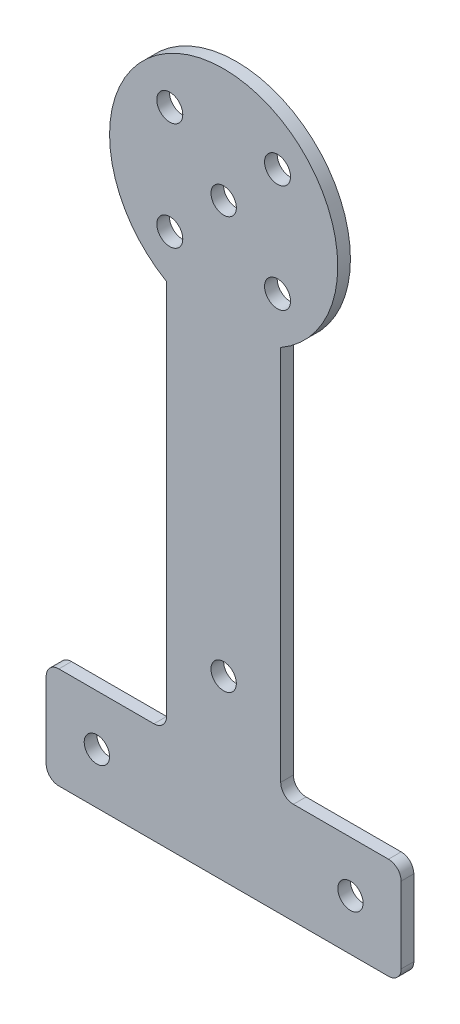
ISO-10303-21;
HEADER;
FILE_DESCRIPTION(('STEP AP214'),'2;1');
FILE_NAME('part.step','',(''),(''),'','','');
FILE_SCHEMA(('AUTOMOTIVE_DESIGN { 1 0 10303 214 1 1 1 1 }'));
ENDSEC;
DATA;
#1=APPLICATION_CONTEXT('core data for automotive mechanical design processes');
#2=APPLICATION_PROTOCOL_DEFINITION('international standard','automotive_design',2000,#1);
#3=PRODUCT_CONTEXT('',#1,'mechanical');
#4=PRODUCT('Part','Part','',(#3));
#5=PRODUCT_RELATED_PRODUCT_CATEGORY('part','',(#4));
#6=PRODUCT_DEFINITION_FORMATION('','',#4);
#7=PRODUCT_DEFINITION_CONTEXT('part definition',#1,'design');
#8=PRODUCT_DEFINITION('design','',#6,#7);
#9=PRODUCT_DEFINITION_SHAPE('','',#8);
#10=(LENGTH_UNIT() NAMED_UNIT(*) SI_UNIT(.MILLI.,.METRE.));
#11=(NAMED_UNIT(*) PLANE_ANGLE_UNIT() SI_UNIT($,.RADIAN.));
#12=(NAMED_UNIT(*) SI_UNIT($,.STERADIAN.) SOLID_ANGLE_UNIT());
#13=UNCERTAINTY_MEASURE_WITH_UNIT(LENGTH_MEASURE(1.E-05),#10,'distance_accuracy_value','');
#14=(GEOMETRIC_REPRESENTATION_CONTEXT(3) GLOBAL_UNCERTAINTY_ASSIGNED_CONTEXT((#13)) GLOBAL_UNIT_ASSIGNED_CONTEXT((#10,
#11,#12)) REPRESENTATION_CONTEXT('',''));
#15=CARTESIAN_POINT('',(0.,0.,0.));
#16=DIRECTION('',(0.,0.,1.));
#17=DIRECTION('',(1.,0.,0.));
#18=AXIS2_PLACEMENT_3D('',#15,#16,#17);
#19=CARTESIAN_POINT('',(-13.3404490284892,112.565520937774,2.));
#20=DIRECTION('',(0.,0.,-1.));
#21=DIRECTION('',(-1.,0.,0.));
#22=AXIS2_PLACEMENT_3D('',#19,#20,#21);
#23=PLANE('',#22);
#24=DIRECTION('',(0.,1.,0.));
#25=VECTOR('',#24,1.);
#26=CARTESIAN_POINT('',(14.6595509715108,19.5655209377735,2.));
#27=LINE('',#26,#25);
#28=CARTESIAN_POINT('',(14.6595509715108,21.5655209377735,2.));
#29=VERTEX_POINT('',#28);
#30=CARTESIAN_POINT('',(14.6595509715108,33.5655209377735,2.));
#31=VERTEX_POINT('',#30);
#32=EDGE_CURVE('E274',#29,#31,#27,.T.);
#33=ORIENTED_EDGE('',*,*,#32,.T.);
#34=CARTESIAN_POINT('',(12.6595509715108,33.5655209377735,2.));
#35=DIRECTION('',(0.,0.,-1.));
#36=DIRECTION('',(-1.,0.,0.));
#37=AXIS2_PLACEMENT_3D('',#34,#35,#36);
#38=CIRCLE('',#37,2.);
#39=CARTESIAN_POINT('',(12.6595509715108,35.5655209377735,2.));
#40=VERTEX_POINT('',#39);
#41=EDGE_CURVE('E229',#31,#40,#38,.F.);
#42=ORIENTED_EDGE('',*,*,#41,.T.);
#43=DIRECTION('',(-1.,0.,0.));
#44=VECTOR('',#43,1.);
#45=CARTESIAN_POINT('',(-4.34044902848922,35.5655209377735,2.));
#46=LINE('',#45,#44);
#47=CARTESIAN_POINT('',(-2.34044902848922,35.5655209377735,2.));
#48=VERTEX_POINT('',#47);
#49=EDGE_CURVE('E151',#40,#48,#46,.T.);
#50=ORIENTED_EDGE('',*,*,#49,.T.);
#51=CARTESIAN_POINT('',(-2.34044902848922,37.5655209377735,2.));
#52=DIRECTION('',(0.,0.,-1.));
#53=DIRECTION('',(-1.,0.,0.));
#54=AXIS2_PLACEMENT_3D('',#51,#52,#53);
#55=CIRCLE('',#54,2.);
#56=CARTESIAN_POINT('',(-4.34044902848922,37.5655209377735,2.));
#57=VERTEX_POINT('',#56);
#58=EDGE_CURVE('E147',#48,#57,#55,.T.);
#59=ORIENTED_EDGE('',*,*,#58,.T.);
#60=DIRECTION('',(0.,1.,0.));
#61=VECTOR('',#60,1.);
#62=CARTESIAN_POINT('',(-4.34044902848922,35.5655209377735,2.));
#63=LINE('',#62,#61);
#64=CARTESIAN_POINT('',(-4.34044902848922,96.9770636696536,2.));
#65=VERTEX_POINT('',#64);
#66=EDGE_CURVE('E137',#57,#65,#63,.T.);
#67=ORIENTED_EDGE('',*,*,#66,.T.);
#68=CARTESIAN_POINT('',(-13.3404490284892,112.565520937774,2.));
#69=DIRECTION('',(0.,0.,1.));
#70=DIRECTION('',(-1.,0.,0.));
#71=AXIS2_PLACEMENT_3D('',#68,#69,#70);
#72=CIRCLE('',#71,18.);
#73=CARTESIAN_POINT('',(-22.3404490284892,96.9770636696536,2.));
#74=VERTEX_POINT('',#73);
#75=EDGE_CURVE('E143',#65,#74,#72,.T.);
#76=ORIENTED_EDGE('',*,*,#75,.T.);
#77=DIRECTION('',(0.,-1.,0.));
#78=VECTOR('',#77,1.);
#79=CARTESIAN_POINT('',(-22.3404490284892,35.5655209377735,2.));
#80=LINE('',#79,#78);
#81=CARTESIAN_POINT('',(-22.3404490284892,37.5655209377735,2.));
#82=VERTEX_POINT('',#81);
#83=EDGE_CURVE('E166',#74,#82,#80,.T.);
#84=ORIENTED_EDGE('',*,*,#83,.T.);
#85=CARTESIAN_POINT('',(-24.3404490284892,37.5655209377735,2.));
#86=DIRECTION('',(0.,0.,-1.));
#87=DIRECTION('',(-1.,0.,0.));
#88=AXIS2_PLACEMENT_3D('',#85,#86,#87);
#89=CIRCLE('',#88,2.);
#90=CARTESIAN_POINT('',(-24.3404490284892,35.5655209377735,2.));
#91=VERTEX_POINT('',#90);
#92=EDGE_CURVE('E11',#82,#91,#89,.T.);
#93=ORIENTED_EDGE('',*,*,#92,.T.);
#94=DIRECTION('',(-1.,0.,0.));
#95=VECTOR('',#94,1.);
#96=CARTESIAN_POINT('',(-41.3404490284892,35.5655209377735,2.));
#97=LINE('',#96,#95);
#98=CARTESIAN_POINT('',(-39.3404490284892,35.5655209377735,2.));
#99=VERTEX_POINT('',#98);
#100=EDGE_CURVE('E168',#91,#99,#97,.T.);
#101=ORIENTED_EDGE('',*,*,#100,.T.);
#102=CARTESIAN_POINT('',(-39.3404490284892,33.5655209377735,2.));
#103=DIRECTION('',(0.,0.,-1.));
#104=DIRECTION('',(-1.,0.,0.));
#105=AXIS2_PLACEMENT_3D('',#102,#103,#104);
#106=CIRCLE('',#105,2.);
#107=CARTESIAN_POINT('',(-41.3404490284892,33.5655209377735,2.));
#108=VERTEX_POINT('',#107);
#109=EDGE_CURVE('E59',#99,#108,#106,.F.);
#110=ORIENTED_EDGE('',*,*,#109,.T.);
#111=DIRECTION('',(0.,-1.,0.));
#112=VECTOR('',#111,1.);
#113=CARTESIAN_POINT('',(-41.3404490284892,19.5655209377735,2.));
#114=LINE('',#113,#112);
#115=CARTESIAN_POINT('',(-41.3404490284892,21.5655209377735,2.));
#116=VERTEX_POINT('',#115);
#117=EDGE_CURVE('E173',#108,#116,#114,.T.);
#118=ORIENTED_EDGE('',*,*,#117,.T.);
#119=CARTESIAN_POINT('',(-39.3404490284892,21.5655209377735,2.));
#120=DIRECTION('',(0.,0.,-1.));
#121=DIRECTION('',(-1.,0.,0.));
#122=AXIS2_PLACEMENT_3D('',#119,#120,#121);
#123=CIRCLE('',#122,2.);
#124=CARTESIAN_POINT('',(-39.3404490284892,19.5655209377735,2.));
#125=VERTEX_POINT('',#124);
#126=EDGE_CURVE('E225',#116,#125,#123,.F.);
#127=ORIENTED_EDGE('',*,*,#126,.T.);
#128=DIRECTION('',(1.,0.,0.));
#129=VECTOR('',#128,1.);
#130=CARTESIAN_POINT('',(-41.3404490284892,19.5655209377735,2.));
#131=LINE('',#130,#129);
#132=CARTESIAN_POINT('',(12.6595509715108,19.5655209377735,2.));
#133=VERTEX_POINT('',#132);
#134=EDGE_CURVE('E196',#125,#133,#131,.T.);
#135=ORIENTED_EDGE('',*,*,#134,.T.);
#136=CARTESIAN_POINT('',(12.6595509715108,21.5655209377735,2.));
#137=DIRECTION('',(0.,0.,-1.));
#138=DIRECTION('',(-1.,0.,0.));
#139=AXIS2_PLACEMENT_3D('',#136,#137,#138);
#140=CIRCLE('',#139,2.);
#141=EDGE_CURVE('E227',#133,#29,#140,.F.);
#142=ORIENTED_EDGE('',*,*,#141,.T.);
#143=EDGE_LOOP('',(#33,#42,#50,#59,#67,#76,#84,#93,#101,#110,#118,#127,#135,#142));
#144=FACE_BOUND('',#143,.T.);
#145=CARTESIAN_POINT('',(-4.84044902848922,121.065520937774,2.));
#146=DIRECTION('',(0.,0.,1.));
#147=DIRECTION('',(1.,0.,0.));
#148=AXIS2_PLACEMENT_3D('',#145,#146,#147);
#149=CIRCLE('',#148,2.05);
#150=CARTESIAN_POINT('',(-2.79044902848922,121.065520937774,2.));
#151=VERTEX_POINT('',#150);
#152=EDGE_CURVE('E179',#151,#151,#149,.T.);
#153=ORIENTED_EDGE('',*,*,#152,.F.);
#154=EDGE_LOOP('',(#153));
#155=FACE_BOUND('',#154,.T.);
#156=CARTESIAN_POINT('',(-33.3404490284892,27.5655209377735,2.));
#157=DIRECTION('',(0.,0.,1.));
#158=DIRECTION('',(1.,0.,0.));
#159=AXIS2_PLACEMENT_3D('',#156,#157,#158);
#160=CIRCLE('',#159,2.);
#161=CARTESIAN_POINT('',(-31.3404490284892,27.5655209377735,2.));
#162=VERTEX_POINT('',#161);
#163=EDGE_CURVE('E511',#162,#162,#160,.T.);
#164=ORIENTED_EDGE('',*,*,#163,.F.);
#165=EDGE_LOOP('',(#164));
#166=FACE_BOUND('',#165,.T.);
#167=CARTESIAN_POINT('',(6.65955097151078,27.5655209377735,2.));
#168=DIRECTION('',(0.,0.,1.));
#169=DIRECTION('',(-1.,0.,0.));
#170=AXIS2_PLACEMENT_3D('',#167,#168,#169);
#171=CIRCLE('',#170,2.00000000000001);
#172=CARTESIAN_POINT('',(4.65955097151077,27.5655209377735,2.));
#173=VERTEX_POINT('',#172);
#174=EDGE_CURVE('E517',#173,#173,#171,.T.);
#175=ORIENTED_EDGE('',*,*,#174,.F.);
#176=EDGE_LOOP('',(#175));
#177=FACE_BOUND('',#176,.T.);
#178=CARTESIAN_POINT('',(-13.3404490284892,112.565520937774,2.));
#179=DIRECTION('',(0.,0.,1.));
#180=DIRECTION('',(1.,0.,0.));
#181=AXIS2_PLACEMENT_3D('',#178,#179,#180);
#182=CIRCLE('',#181,2.);
#183=CARTESIAN_POINT('',(-11.3404490284892,112.565520937774,2.));
#184=VERTEX_POINT('',#183);
#185=EDGE_CURVE('E523',#184,#184,#182,.T.);
#186=ORIENTED_EDGE('',*,*,#185,.F.);
#187=EDGE_LOOP('',(#186));
#188=FACE_BOUND('',#187,.T.);
#189=CARTESIAN_POINT('',(-4.840449028489,104.065520937773,2.));
#190=DIRECTION('',(0.,0.,1.));
#191=DIRECTION('',(1.,0.,0.));
#192=AXIS2_PLACEMENT_3D('',#189,#190,#191);
#193=CIRCLE('',#192,2.04999999999999);
#194=CARTESIAN_POINT('',(-2.79044902848901,104.065520937773,2.));
#195=VERTEX_POINT('',#194);
#196=EDGE_CURVE('E529',#195,#195,#193,.T.);
#197=ORIENTED_EDGE('',*,*,#196,.F.);
#198=EDGE_LOOP('',(#197));
#199=FACE_BOUND('',#198,.T.);
#200=CARTESIAN_POINT('',(-21.840449028489,104.065520937773,2.));
#201=DIRECTION('',(0.,0.,1.));
#202=DIRECTION('',(1.,0.,0.));
#203=AXIS2_PLACEMENT_3D('',#200,#201,#202);
#204=CIRCLE('',#203,2.05);
#205=CARTESIAN_POINT('',(-19.790449028489,104.065520937773,2.));
#206=VERTEX_POINT('',#205);
#207=EDGE_CURVE('E535',#206,#206,#204,.T.);
#208=ORIENTED_EDGE('',*,*,#207,.F.);
#209=EDGE_LOOP('',(#208));
#210=FACE_BOUND('',#209,.T.);
#211=CARTESIAN_POINT('',(-21.8404490284892,121.065520937773,2.));
#212=DIRECTION('',(0.,0.,1.));
#213=DIRECTION('',(1.,0.,0.));
#214=AXIS2_PLACEMENT_3D('',#211,#212,#213);
#215=CIRCLE('',#214,2.05);
#216=CARTESIAN_POINT('',(-19.7904490284892,121.065520937773,2.));
#217=VERTEX_POINT('',#216);
#218=EDGE_CURVE('E541',#217,#217,#215,.T.);
#219=ORIENTED_EDGE('',*,*,#218,.F.);
#220=EDGE_LOOP('',(#219));
#221=FACE_BOUND('',#220,.T.);
#222=CARTESIAN_POINT('',(-13.3404490284892,47.5655209377735,2.));
#223=DIRECTION('',(0.,0.,1.));
#224=DIRECTION('',(1.,0.,0.));
#225=AXIS2_PLACEMENT_3D('',#222,#223,#224);
#226=CIRCLE('',#225,2.00000000000001);
#227=CARTESIAN_POINT('',(-11.3404490284892,47.5655209377735,2.));
#228=VERTEX_POINT('',#227);
#229=EDGE_CURVE('E547',#228,#228,#226,.T.);
#230=ORIENTED_EDGE('',*,*,#229,.F.);
#231=EDGE_LOOP('',(#230));
#232=FACE_BOUND('',#231,.T.);
#233=ADVANCED_FACE('F37',(#144,#155,#166,#177,#188,#199,#210,#221,#232),#23,.F.);
#234=CARTESIAN_POINT('',(-13.3404490284892,112.565520937774,0.));
#235=DIRECTION('',(0.,0.,-1.));
#236=DIRECTION('',(-1.,0.,0.));
#237=AXIS2_PLACEMENT_3D('',#234,#235,#236);
#238=PLANE('',#237);
#239=CARTESIAN_POINT('',(-21.8404490284892,121.065520937773,0.));
#240=DIRECTION('',(0.,0.,1.));
#241=DIRECTION('',(1.,0.,0.));
#242=AXIS2_PLACEMENT_3D('',#239,#240,#241);
#243=CIRCLE('',#242,2.05);
#244=CARTESIAN_POINT('',(-19.7904490284892,121.065520937773,0.));
#245=VERTEX_POINT('',#244);
#246=EDGE_CURVE('E544',#245,#245,#243,.T.);
#247=ORIENTED_EDGE('',*,*,#246,.T.);
#248=EDGE_LOOP('',(#247));
#249=FACE_BOUND('',#248,.T.);
#250=CARTESIAN_POINT('',(-4.840449028489,104.065520937773,0.));
#251=DIRECTION('',(0.,0.,1.));
#252=DIRECTION('',(1.,0.,0.));
#253=AXIS2_PLACEMENT_3D('',#250,#251,#252);
#254=CIRCLE('',#253,2.04999999999999);
#255=CARTESIAN_POINT('',(-2.79044902848901,104.065520937773,0.));
#256=VERTEX_POINT('',#255);
#257=EDGE_CURVE('E532',#256,#256,#254,.T.);
#258=ORIENTED_EDGE('',*,*,#257,.T.);
#259=EDGE_LOOP('',(#258));
#260=FACE_BOUND('',#259,.T.);
#261=CARTESIAN_POINT('',(6.65955097151078,27.5655209377735,0.));
#262=DIRECTION('',(0.,0.,1.));
#263=DIRECTION('',(-1.,0.,0.));
#264=AXIS2_PLACEMENT_3D('',#261,#262,#263);
#265=CIRCLE('',#264,2.00000000000001);
#266=CARTESIAN_POINT('',(4.65955097151077,27.5655209377735,0.));
#267=VERTEX_POINT('',#266);
#268=EDGE_CURVE('E520',#267,#267,#265,.T.);
#269=ORIENTED_EDGE('',*,*,#268,.T.);
#270=EDGE_LOOP('',(#269));
#271=FACE_BOUND('',#270,.T.);
#272=CARTESIAN_POINT('',(-4.84044902848922,121.065520937774,0.));
#273=DIRECTION('',(0.,0.,1.));
#274=DIRECTION('',(1.,0.,0.));
#275=AXIS2_PLACEMENT_3D('',#272,#273,#274);
#276=CIRCLE('',#275,2.05);
#277=CARTESIAN_POINT('',(-2.79044902848922,121.065520937774,0.));
#278=VERTEX_POINT('',#277);
#279=EDGE_CURVE('E278',#278,#278,#276,.T.);
#280=ORIENTED_EDGE('',*,*,#279,.T.);
#281=EDGE_LOOP('',(#280));
#282=FACE_BOUND('',#281,.T.);
#283=DIRECTION('',(-1.,0.,0.));
#284=VECTOR('',#283,1.);
#285=CARTESIAN_POINT('',(-4.34044902848922,35.5655209377735,0.));
#286=LINE('',#285,#284);
#287=CARTESIAN_POINT('',(12.6595509715108,35.5655209377735,0.));
#288=VERTEX_POINT('',#287);
#289=CARTESIAN_POINT('',(-2.34044902848922,35.5655209377735,0.));
#290=VERTEX_POINT('',#289);
#291=EDGE_CURVE('E182',#288,#290,#286,.T.);
#292=ORIENTED_EDGE('',*,*,#291,.F.);
#293=CARTESIAN_POINT('',(12.6595509715108,33.5655209377735,0.));
#294=DIRECTION('',(0.,0.,-1.));
#295=DIRECTION('',(-1.,0.,0.));
#296=AXIS2_PLACEMENT_3D('',#293,#294,#295);
#297=CIRCLE('',#296,2.);
#298=CARTESIAN_POINT('',(14.6595509715108,33.5655209377735,0.));
#299=VERTEX_POINT('',#298);
#300=EDGE_CURVE('E217',#288,#299,#297,.T.);
#301=ORIENTED_EDGE('',*,*,#300,.T.);
#302=DIRECTION('',(0.,1.,0.));
#303=VECTOR('',#302,1.);
#304=CARTESIAN_POINT('',(14.6595509715108,19.5655209377735,0.));
#305=LINE('',#304,#303);
#306=CARTESIAN_POINT('',(14.6595509715108,21.5655209377735,0.));
#307=VERTEX_POINT('',#306);
#308=EDGE_CURVE('E178',#307,#299,#305,.T.);
#309=ORIENTED_EDGE('',*,*,#308,.F.);
#310=CARTESIAN_POINT('',(12.6595509715108,21.5655209377735,0.));
#311=DIRECTION('',(0.,0.,-1.));
#312=DIRECTION('',(-1.,0.,0.));
#313=AXIS2_PLACEMENT_3D('',#310,#311,#312);
#314=CIRCLE('',#313,2.);
#315=CARTESIAN_POINT('',(12.6595509715108,19.5655209377735,0.));
#316=VERTEX_POINT('',#315);
#317=EDGE_CURVE('E215',#307,#316,#314,.T.);
#318=ORIENTED_EDGE('',*,*,#317,.T.);
#319=DIRECTION('',(1.,0.,0.));
#320=VECTOR('',#319,1.);
#321=CARTESIAN_POINT('',(-41.3404490284892,19.5655209377735,0.));
#322=LINE('',#321,#320);
#323=CARTESIAN_POINT('',(-39.3404490284892,19.5655209377735,0.));
#324=VERTEX_POINT('',#323);
#325=EDGE_CURVE('E175',#324,#316,#322,.T.);
#326=ORIENTED_EDGE('',*,*,#325,.F.);
#327=CARTESIAN_POINT('',(-39.3404490284892,21.5655209377735,0.));
#328=DIRECTION('',(0.,0.,-1.));
#329=DIRECTION('',(-1.,0.,0.));
#330=AXIS2_PLACEMENT_3D('',#327,#328,#329);
#331=CIRCLE('',#330,2.);
#332=CARTESIAN_POINT('',(-41.3404490284892,21.5655209377735,0.));
#333=VERTEX_POINT('',#332);
#334=EDGE_CURVE('E213',#324,#333,#331,.T.);
#335=ORIENTED_EDGE('',*,*,#334,.T.);
#336=DIRECTION('',(0.,-1.,0.));
#337=VECTOR('',#336,1.);
#338=CARTESIAN_POINT('',(-41.3404490284892,19.5655209377735,0.));
#339=LINE('',#338,#337);
#340=CARTESIAN_POINT('',(-41.3404490284892,33.5655209377735,0.));
#341=VERTEX_POINT('',#340);
#342=EDGE_CURVE('E194',#341,#333,#339,.T.);
#343=ORIENTED_EDGE('',*,*,#342,.F.);
#344=CARTESIAN_POINT('',(-39.3404490284892,33.5655209377735,0.));
#345=DIRECTION('',(0.,0.,-1.));
#346=DIRECTION('',(-1.,0.,0.));
#347=AXIS2_PLACEMENT_3D('',#344,#345,#346);
#348=CIRCLE('',#347,2.);
#349=CARTESIAN_POINT('',(-39.3404490284892,35.5655209377735,0.));
#350=VERTEX_POINT('',#349);
#351=EDGE_CURVE('E211',#341,#350,#348,.T.);
#352=ORIENTED_EDGE('',*,*,#351,.T.);
#353=DIRECTION('',(-1.,0.,0.));
#354=VECTOR('',#353,1.);
#355=CARTESIAN_POINT('',(-41.3404490284892,35.5655209377735,0.));
#356=LINE('',#355,#354);
#357=CARTESIAN_POINT('',(-24.3404490284892,35.5655209377735,0.));
#358=VERTEX_POINT('',#357);
#359=EDGE_CURVE('E191',#358,#350,#356,.T.);
#360=ORIENTED_EDGE('',*,*,#359,.F.);
#361=CARTESIAN_POINT('',(-24.3404490284892,37.5655209377735,0.));
#362=DIRECTION('',(0.,0.,-1.));
#363=DIRECTION('',(-1.,0.,0.));
#364=AXIS2_PLACEMENT_3D('',#361,#362,#363);
#365=CIRCLE('',#364,2.);
#366=CARTESIAN_POINT('',(-22.3404490284892,37.5655209377735,0.));
#367=VERTEX_POINT('',#366);
#368=EDGE_CURVE('E45',#358,#367,#365,.F.);
#369=ORIENTED_EDGE('',*,*,#368,.T.);
#370=DIRECTION('',(0.,-1.,0.));
#371=VECTOR('',#370,1.);
#372=CARTESIAN_POINT('',(-22.3404490284892,35.5655209377735,0.));
#373=LINE('',#372,#371);
#374=CARTESIAN_POINT('',(-22.3404490284892,96.9770636696536,0.));
#375=VERTEX_POINT('',#374);
#376=EDGE_CURVE('E188',#375,#367,#373,.T.);
#377=ORIENTED_EDGE('',*,*,#376,.F.);
#378=CARTESIAN_POINT('',(-13.3404490284892,112.565520937774,0.));
#379=DIRECTION('',(0.,0.,1.));
#380=DIRECTION('',(-1.,0.,0.));
#381=AXIS2_PLACEMENT_3D('',#378,#379,#380);
#382=CIRCLE('',#381,18.);
#383=CARTESIAN_POINT('',(-4.34044902848922,96.9770636696536,0.));
#384=VERTEX_POINT('',#383);
#385=EDGE_CURVE('E186',#384,#375,#382,.T.);
#386=ORIENTED_EDGE('',*,*,#385,.F.);
#387=DIRECTION('',(0.,1.,0.));
#388=VECTOR('',#387,1.);
#389=CARTESIAN_POINT('',(-4.34044902848922,35.5655209377735,0.));
#390=LINE('',#389,#388);
#391=CARTESIAN_POINT('',(-4.34044902848922,37.5655209377735,0.));
#392=VERTEX_POINT('',#391);
#393=EDGE_CURVE('E157',#392,#384,#390,.T.);
#394=ORIENTED_EDGE('',*,*,#393,.F.);
#395=CARTESIAN_POINT('',(-2.34044902848922,37.5655209377735,0.));
#396=DIRECTION('',(0.,0.,-1.));
#397=DIRECTION('',(-1.,0.,0.));
#398=AXIS2_PLACEMENT_3D('',#395,#396,#397);
#399=CIRCLE('',#398,2.);
#400=EDGE_CURVE('E240',#392,#290,#399,.F.);
#401=ORIENTED_EDGE('',*,*,#400,.T.);
#402=EDGE_LOOP('',(#292,#301,#309,#318,#326,#335,#343,#352,#360,#369,#377,#386,#394,#401));
#403=FACE_BOUND('',#402,.T.);
#404=CARTESIAN_POINT('',(-33.3404490284892,27.5655209377735,0.));
#405=DIRECTION('',(0.,0.,1.));
#406=DIRECTION('',(1.,0.,0.));
#407=AXIS2_PLACEMENT_3D('',#404,#405,#406);
#408=CIRCLE('',#407,2.);
#409=CARTESIAN_POINT('',(-31.3404490284892,27.5655209377735,0.));
#410=VERTEX_POINT('',#409);
#411=EDGE_CURVE('E513',#410,#410,#408,.T.);
#412=ORIENTED_EDGE('',*,*,#411,.T.);
#413=EDGE_LOOP('',(#412));
#414=FACE_BOUND('',#413,.T.);
#415=CARTESIAN_POINT('',(-13.3404490284892,112.565520937774,0.));
#416=DIRECTION('',(0.,0.,1.));
#417=DIRECTION('',(1.,0.,0.));
#418=AXIS2_PLACEMENT_3D('',#415,#416,#417);
#419=CIRCLE('',#418,2.);
#420=CARTESIAN_POINT('',(-11.3404490284892,112.565520937774,0.));
#421=VERTEX_POINT('',#420);
#422=EDGE_CURVE('E526',#421,#421,#419,.T.);
#423=ORIENTED_EDGE('',*,*,#422,.T.);
#424=EDGE_LOOP('',(#423));
#425=FACE_BOUND('',#424,.T.);
#426=CARTESIAN_POINT('',(-21.840449028489,104.065520937773,0.));
#427=DIRECTION('',(0.,0.,1.));
#428=DIRECTION('',(1.,0.,0.));
#429=AXIS2_PLACEMENT_3D('',#426,#427,#428);
#430=CIRCLE('',#429,2.05);
#431=CARTESIAN_POINT('',(-19.790449028489,104.065520937773,0.));
#432=VERTEX_POINT('',#431);
#433=EDGE_CURVE('E538',#432,#432,#430,.T.);
#434=ORIENTED_EDGE('',*,*,#433,.T.);
#435=EDGE_LOOP('',(#434));
#436=FACE_BOUND('',#435,.T.);
#437=CARTESIAN_POINT('',(-13.3404490284892,47.5655209377735,0.));
#438=DIRECTION('',(0.,0.,1.));
#439=DIRECTION('',(1.,0.,0.));
#440=AXIS2_PLACEMENT_3D('',#437,#438,#439);
#441=CIRCLE('',#440,2.00000000000001);
#442=CARTESIAN_POINT('',(-11.3404490284892,47.5655209377735,0.));
#443=VERTEX_POINT('',#442);
#444=EDGE_CURVE('E550',#443,#443,#441,.T.);
#445=ORIENTED_EDGE('',*,*,#444,.T.);
#446=EDGE_LOOP('',(#445));
#447=FACE_BOUND('',#446,.T.);
#448=ADVANCED_FACE('F246',(#249,#260,#271,#282,#403,#414,#425,#436,#447),#238,.T.);
#449=CARTESIAN_POINT('',(-41.3404490284892,19.5655209377735,2.));
#450=DIRECTION('',(0.,1.,0.));
#451=DIRECTION('',(0.,0.,1.));
#452=AXIS2_PLACEMENT_3D('',#449,#450,#451);
#453=PLANE('',#452);
#454=ORIENTED_EDGE('',*,*,#325,.T.);
#455=DIRECTION('',(0.,0.,-1.));
#456=VECTOR('',#455,1.);
#457=CARTESIAN_POINT('',(12.6595509715108,19.5655209377735,2.));
#458=LINE('',#457,#456);
#459=EDGE_CURVE('E234',#316,#133,#458,.F.);
#460=ORIENTED_EDGE('',*,*,#459,.T.);
#461=ORIENTED_EDGE('',*,*,#134,.F.);
#462=DIRECTION('',(0.,0.,-1.));
#463=VECTOR('',#462,1.);
#464=CARTESIAN_POINT('',(-39.3404490284892,19.5655209377735,2.));
#465=LINE('',#464,#463);
#466=EDGE_CURVE('E231',#125,#324,#465,.T.);
#467=ORIENTED_EDGE('',*,*,#466,.T.);
#468=EDGE_LOOP('',(#454,#460,#461,#467));
#469=FACE_BOUND('',#468,.T.);
#470=ADVANCED_FACE('F270',(#469),#453,.F.);
#471=CARTESIAN_POINT('',(14.6595509715108,19.5655209377735,2.));
#472=DIRECTION('',(-1.,0.,0.));
#473=DIRECTION('',(0.,0.,1.));
#474=AXIS2_PLACEMENT_3D('',#471,#472,#473);
#475=PLANE('',#474);
#476=ORIENTED_EDGE('',*,*,#308,.T.);
#477=DIRECTION('',(0.,0.,-1.));
#478=VECTOR('',#477,1.);
#479=CARTESIAN_POINT('',(14.6595509715108,33.5655209377735,2.));
#480=LINE('',#479,#478);
#481=EDGE_CURVE('E222',#299,#31,#480,.F.);
#482=ORIENTED_EDGE('',*,*,#481,.T.);
#483=ORIENTED_EDGE('',*,*,#32,.F.);
#484=DIRECTION('',(0.,0.,-1.));
#485=VECTOR('',#484,1.);
#486=CARTESIAN_POINT('',(14.6595509715108,21.5655209377735,2.));
#487=LINE('',#486,#485);
#488=EDGE_CURVE('E219',#29,#307,#487,.T.);
#489=ORIENTED_EDGE('',*,*,#488,.T.);
#490=EDGE_LOOP('',(#476,#482,#483,#489));
#491=FACE_BOUND('',#490,.T.);
#492=ADVANCED_FACE('F293',(#491),#475,.F.);
#493=CARTESIAN_POINT('',(-4.34044902848922,35.5655209377735,2.));
#494=DIRECTION('',(0.,-1.,0.));
#495=DIRECTION('',(0.,0.,-1.));
#496=AXIS2_PLACEMENT_3D('',#493,#494,#495);
#497=PLANE('',#496);
#498=ORIENTED_EDGE('',*,*,#291,.T.);
#499=DIRECTION('',(0.,0.,-1.));
#500=VECTOR('',#499,1.);
#501=CARTESIAN_POINT('',(-2.34044902848922,35.5655209377735,2.));
#502=LINE('',#501,#500);
#503=EDGE_CURVE('E202',#290,#48,#502,.F.);
#504=ORIENTED_EDGE('',*,*,#503,.T.);
#505=ORIENTED_EDGE('',*,*,#49,.F.);
#506=DIRECTION('',(0.,0.,-1.));
#507=VECTOR('',#506,1.);
#508=CARTESIAN_POINT('',(12.6595509715108,35.5655209377735,2.));
#509=LINE('',#508,#507);
#510=EDGE_CURVE('E199',#40,#288,#509,.T.);
#511=ORIENTED_EDGE('',*,*,#510,.T.);
#512=EDGE_LOOP('',(#498,#504,#505,#511));
#513=FACE_BOUND('',#512,.T.);
#514=ADVANCED_FACE('F287',(#513),#497,.F.);
#515=CARTESIAN_POINT('',(-4.34044902848922,35.5655209377735,2.));
#516=DIRECTION('',(-1.,0.,0.));
#517=DIRECTION('',(0.,0.,1.));
#518=AXIS2_PLACEMENT_3D('',#515,#516,#517);
#519=PLANE('',#518);
#520=ORIENTED_EDGE('',*,*,#66,.F.);
#521=DIRECTION('',(0.,0.,-1.));
#522=VECTOR('',#521,1.);
#523=CARTESIAN_POINT('',(-4.34044902848922,37.5655209377735,0.));
#524=LINE('',#523,#522);
#525=EDGE_CURVE('E160',#57,#392,#524,.T.);
#526=ORIENTED_EDGE('',*,*,#525,.T.);
#527=ORIENTED_EDGE('',*,*,#393,.T.);
#528=DIRECTION('',(0.,0.,-1.));
#529=VECTOR('',#528,1.);
#530=CARTESIAN_POINT('',(-4.34044902848922,96.9770636696536,2.));
#531=LINE('',#530,#529);
#532=EDGE_CURVE('E154',#65,#384,#531,.T.);
#533=ORIENTED_EDGE('',*,*,#532,.F.);
#534=EDGE_LOOP('',(#520,#526,#527,#533));
#535=FACE_BOUND('',#534,.T.);
#536=ADVANCED_FACE('F155',(#535),#519,.F.);
#537=CARTESIAN_POINT('',(-13.3404490284892,112.565520937774,2.));
#538=DIRECTION('',(0.,0.,-1.));
#539=DIRECTION('',(-1.,0.,0.));
#540=AXIS2_PLACEMENT_3D('',#537,#538,#539);
#541=CYLINDRICAL_SURFACE('',#540,18.);
#542=ORIENTED_EDGE('',*,*,#385,.T.);
#543=DIRECTION('',(0.,0.,-1.));
#544=VECTOR('',#543,1.);
#545=CARTESIAN_POINT('',(-22.3404490284892,96.9770636696536,2.));
#546=LINE('',#545,#544);
#547=EDGE_CURVE('E161',#74,#375,#546,.T.);
#548=ORIENTED_EDGE('',*,*,#547,.F.);
#549=ORIENTED_EDGE('',*,*,#75,.F.);
#550=ORIENTED_EDGE('',*,*,#532,.T.);
#551=EDGE_LOOP('',(#542,#548,#549,#550));
#552=FACE_BOUND('',#551,.T.);
#553=ADVANCED_FACE('F163',(#552),#541,.T.);
#554=CARTESIAN_POINT('',(-22.3404490284892,35.5655209377735,2.));
#555=DIRECTION('',(1.,0.,0.));
#556=DIRECTION('',(0.,0.,-1.));
#557=AXIS2_PLACEMENT_3D('',#554,#555,#556);
#558=PLANE('',#557);
#559=ORIENTED_EDGE('',*,*,#376,.T.);
#560=DIRECTION('',(0.,0.,-1.));
#561=VECTOR('',#560,1.);
#562=CARTESIAN_POINT('',(-22.3404490284892,37.5655209377735,2.));
#563=LINE('',#562,#561);
#564=EDGE_CURVE('E209',#367,#82,#563,.F.);
#565=ORIENTED_EDGE('',*,*,#564,.T.);
#566=ORIENTED_EDGE('',*,*,#83,.F.);
#567=ORIENTED_EDGE('',*,*,#547,.T.);
#568=EDGE_LOOP('',(#559,#565,#566,#567));
#569=FACE_BOUND('',#568,.T.);
#570=ADVANCED_FACE('F252',(#569),#558,.F.);
#571=CARTESIAN_POINT('',(-41.3404490284892,35.5655209377735,2.));
#572=DIRECTION('',(0.,-1.,0.));
#573=DIRECTION('',(0.,0.,-1.));
#574=AXIS2_PLACEMENT_3D('',#571,#572,#573);
#575=PLANE('',#574);
#576=ORIENTED_EDGE('',*,*,#100,.F.);
#577=DIRECTION('',(0.,0.,-1.));
#578=VECTOR('',#577,1.);
#579=CARTESIAN_POINT('',(-24.3404490284892,35.5655209377735,0.));
#580=LINE('',#579,#578);
#581=EDGE_CURVE('E206',#91,#358,#580,.T.);
#582=ORIENTED_EDGE('',*,*,#581,.T.);
#583=ORIENTED_EDGE('',*,*,#359,.T.);
#584=DIRECTION('',(0.,0.,-1.));
#585=VECTOR('',#584,1.);
#586=CARTESIAN_POINT('',(-39.3404490284892,35.5655209377735,2.));
#587=LINE('',#586,#585);
#588=EDGE_CURVE('E204',#350,#99,#587,.F.);
#589=ORIENTED_EDGE('',*,*,#588,.T.);
#590=EDGE_LOOP('',(#576,#582,#583,#589));
#591=FACE_BOUND('',#590,.T.);
#592=ADVANCED_FACE('F257',(#591),#575,.F.);
#593=CARTESIAN_POINT('',(-41.3404490284892,19.5655209377735,2.));
#594=DIRECTION('',(1.,0.,0.));
#595=DIRECTION('',(0.,0.,-1.));
#596=AXIS2_PLACEMENT_3D('',#593,#594,#595);
#597=PLANE('',#596);
#598=ORIENTED_EDGE('',*,*,#342,.T.);
#599=DIRECTION('',(0.,0.,-1.));
#600=VECTOR('',#599,1.);
#601=CARTESIAN_POINT('',(-41.3404490284892,21.5655209377735,2.));
#602=LINE('',#601,#600);
#603=EDGE_CURVE('E52',#333,#116,#602,.F.);
#604=ORIENTED_EDGE('',*,*,#603,.T.);
#605=ORIENTED_EDGE('',*,*,#117,.F.);
#606=DIRECTION('',(0.,0.,-1.));
#607=VECTOR('',#606,1.);
#608=CARTESIAN_POINT('',(-41.3404490284892,33.5655209377735,2.));
#609=LINE('',#608,#607);
#610=EDGE_CURVE('E236',#108,#341,#609,.T.);
#611=ORIENTED_EDGE('',*,*,#610,.T.);
#612=EDGE_LOOP('',(#598,#604,#605,#611));
#613=FACE_BOUND('',#612,.T.);
#614=ADVANCED_FACE('F262',(#613),#597,.F.);
#615=CARTESIAN_POINT('',(-4.84044902848922,121.065520937774,2.));
#616=DIRECTION('',(0.,0.,-1.));
#617=DIRECTION('',(-1.,0.,0.));
#618=AXIS2_PLACEMENT_3D('',#615,#616,#617);
#619=CYLINDRICAL_SURFACE('',#618,2.05);
#620=ORIENTED_EDGE('',*,*,#152,.T.);
#621=EDGE_LOOP('',(#620));
#622=FACE_BOUND('',#621,.T.);
#623=ORIENTED_EDGE('',*,*,#279,.F.);
#624=EDGE_LOOP('',(#623));
#625=FACE_BOUND('',#624,.T.);
#626=ADVANCED_FACE('F313',(#622,#625),#619,.F.);
#627=CARTESIAN_POINT('',(-33.3404490284892,27.5655209377735,2.));
#628=DIRECTION('',(0.,0.,-1.));
#629=DIRECTION('',(-1.,0.,0.));
#630=AXIS2_PLACEMENT_3D('',#627,#628,#629);
#631=CYLINDRICAL_SURFACE('',#630,2.);
#632=ORIENTED_EDGE('',*,*,#163,.T.);
#633=EDGE_LOOP('',(#632));
#634=FACE_BOUND('',#633,.T.);
#635=ORIENTED_EDGE('',*,*,#411,.F.);
#636=EDGE_LOOP('',(#635));
#637=FACE_BOUND('',#636,.T.);
#638=ADVANCED_FACE('F423',(#634,#637),#631,.F.);
#639=CARTESIAN_POINT('',(6.65955097151078,27.5655209377735,2.));
#640=DIRECTION('',(0.,0.,-1.));
#641=DIRECTION('',(-1.,0.,0.));
#642=AXIS2_PLACEMENT_3D('',#639,#640,#641);
#643=CYLINDRICAL_SURFACE('',#642,2.00000000000001);
#644=ORIENTED_EDGE('',*,*,#174,.T.);
#645=EDGE_LOOP('',(#644));
#646=FACE_BOUND('',#645,.T.);
#647=ORIENTED_EDGE('',*,*,#268,.F.);
#648=EDGE_LOOP('',(#647));
#649=FACE_BOUND('',#648,.T.);
#650=ADVANCED_FACE('F414',(#646,#649),#643,.F.);
#651=CARTESIAN_POINT('',(-13.3404490284892,112.565520937774,2.));
#652=DIRECTION('',(0.,0.,-1.));
#653=DIRECTION('',(-1.,0.,0.));
#654=AXIS2_PLACEMENT_3D('',#651,#652,#653);
#655=CYLINDRICAL_SURFACE('',#654,2.);
#656=ORIENTED_EDGE('',*,*,#185,.T.);
#657=EDGE_LOOP('',(#656));
#658=FACE_BOUND('',#657,.T.);
#659=ORIENTED_EDGE('',*,*,#422,.F.);
#660=EDGE_LOOP('',(#659));
#661=FACE_BOUND('',#660,.T.);
#662=ADVANCED_FACE('F405',(#658,#661),#655,.F.);
#663=CARTESIAN_POINT('',(-4.840449028489,104.065520937773,2.));
#664=DIRECTION('',(0.,0.,-1.));
#665=DIRECTION('',(-1.,0.,0.));
#666=AXIS2_PLACEMENT_3D('',#663,#664,#665);
#667=CYLINDRICAL_SURFACE('',#666,2.04999999999999);
#668=ORIENTED_EDGE('',*,*,#196,.T.);
#669=EDGE_LOOP('',(#668));
#670=FACE_BOUND('',#669,.T.);
#671=ORIENTED_EDGE('',*,*,#257,.F.);
#672=EDGE_LOOP('',(#671));
#673=FACE_BOUND('',#672,.T.);
#674=ADVANCED_FACE('F396',(#670,#673),#667,.F.);
#675=CARTESIAN_POINT('',(-21.840449028489,104.065520937773,2.));
#676=DIRECTION('',(0.,0.,-1.));
#677=DIRECTION('',(-1.,0.,0.));
#678=AXIS2_PLACEMENT_3D('',#675,#676,#677);
#679=CYLINDRICAL_SURFACE('',#678,2.05);
#680=ORIENTED_EDGE('',*,*,#207,.T.);
#681=EDGE_LOOP('',(#680));
#682=FACE_BOUND('',#681,.T.);
#683=ORIENTED_EDGE('',*,*,#433,.F.);
#684=EDGE_LOOP('',(#683));
#685=FACE_BOUND('',#684,.T.);
#686=ADVANCED_FACE('F387',(#682,#685),#679,.F.);
#687=CARTESIAN_POINT('',(-21.8404490284892,121.065520937773,2.));
#688=DIRECTION('',(0.,0.,-1.));
#689=DIRECTION('',(-1.,0.,0.));
#690=AXIS2_PLACEMENT_3D('',#687,#688,#689);
#691=CYLINDRICAL_SURFACE('',#690,2.05);
#692=ORIENTED_EDGE('',*,*,#218,.T.);
#693=EDGE_LOOP('',(#692));
#694=FACE_BOUND('',#693,.T.);
#695=ORIENTED_EDGE('',*,*,#246,.F.);
#696=EDGE_LOOP('',(#695));
#697=FACE_BOUND('',#696,.T.);
#698=ADVANCED_FACE('F378',(#694,#697),#691,.F.);
#699=CARTESIAN_POINT('',(-13.3404490284892,47.5655209377735,2.));
#700=DIRECTION('',(0.,0.,-1.));
#701=DIRECTION('',(-1.,0.,0.));
#702=AXIS2_PLACEMENT_3D('',#699,#700,#701);
#703=CYLINDRICAL_SURFACE('',#702,2.00000000000001);
#704=ORIENTED_EDGE('',*,*,#229,.T.);
#705=EDGE_LOOP('',(#704));
#706=FACE_BOUND('',#705,.T.);
#707=ORIENTED_EDGE('',*,*,#444,.F.);
#708=EDGE_LOOP('',(#707));
#709=FACE_BOUND('',#708,.T.);
#710=ADVANCED_FACE('F334',(#706,#709),#703,.F.);
#711=CARTESIAN_POINT('',(-2.34044902848922,37.5655209377735,2.));
#712=DIRECTION('',(0.,0.,1.));
#713=DIRECTION('',(1.,0.,0.));
#714=AXIS2_PLACEMENT_3D('',#711,#712,#713);
#715=CYLINDRICAL_SURFACE('',#714,2.);
#716=ORIENTED_EDGE('',*,*,#58,.F.);
#717=ORIENTED_EDGE('',*,*,#503,.F.);
#718=ORIENTED_EDGE('',*,*,#400,.F.);
#719=ORIENTED_EDGE('',*,*,#525,.F.);
#720=EDGE_LOOP('',(#716,#717,#718,#719));
#721=FACE_BOUND('',#720,.T.);
#722=ADVANCED_FACE('F286',(#721),#715,.F.);
#723=CARTESIAN_POINT('',(-24.3404490284892,37.5655209377735,2.));
#724=DIRECTION('',(0.,0.,1.));
#725=DIRECTION('',(1.,0.,0.));
#726=AXIS2_PLACEMENT_3D('',#723,#724,#725);
#727=CYLINDRICAL_SURFACE('',#726,2.);
#728=ORIENTED_EDGE('',*,*,#92,.F.);
#729=ORIENTED_EDGE('',*,*,#564,.F.);
#730=ORIENTED_EDGE('',*,*,#368,.F.);
#731=ORIENTED_EDGE('',*,*,#581,.F.);
#732=EDGE_LOOP('',(#728,#729,#730,#731));
#733=FACE_BOUND('',#732,.T.);
#734=ADVANCED_FACE('F254',(#733),#727,.F.);
#735=CARTESIAN_POINT('',(12.6595509715108,33.5655209377735,2.));
#736=DIRECTION('',(0.,0.,-1.));
#737=DIRECTION('',(-1.,0.,0.));
#738=AXIS2_PLACEMENT_3D('',#735,#736,#737);
#739=CYLINDRICAL_SURFACE('',#738,2.);
#740=ORIENTED_EDGE('',*,*,#41,.F.);
#741=ORIENTED_EDGE('',*,*,#481,.F.);
#742=ORIENTED_EDGE('',*,*,#300,.F.);
#743=ORIENTED_EDGE('',*,*,#510,.F.);
#744=EDGE_LOOP('',(#740,#741,#742,#743));
#745=FACE_BOUND('',#744,.T.);
#746=ADVANCED_FACE('F289',(#745),#739,.T.);
#747=CARTESIAN_POINT('',(12.6595509715108,21.5655209377735,2.));
#748=DIRECTION('',(0.,0.,-1.));
#749=DIRECTION('',(-1.,0.,0.));
#750=AXIS2_PLACEMENT_3D('',#747,#748,#749);
#751=CYLINDRICAL_SURFACE('',#750,2.);
#752=ORIENTED_EDGE('',*,*,#141,.F.);
#753=ORIENTED_EDGE('',*,*,#459,.F.);
#754=ORIENTED_EDGE('',*,*,#317,.F.);
#755=ORIENTED_EDGE('',*,*,#488,.F.);
#756=EDGE_LOOP('',(#752,#753,#754,#755));
#757=FACE_BOUND('',#756,.T.);
#758=ADVANCED_FACE('F297',(#757),#751,.T.);
#759=CARTESIAN_POINT('',(-39.3404490284892,21.5655209377735,2.));
#760=DIRECTION('',(0.,0.,-1.));
#761=DIRECTION('',(-1.,0.,0.));
#762=AXIS2_PLACEMENT_3D('',#759,#760,#761);
#763=CYLINDRICAL_SURFACE('',#762,2.);
#764=ORIENTED_EDGE('',*,*,#126,.F.);
#765=ORIENTED_EDGE('',*,*,#603,.F.);
#766=ORIENTED_EDGE('',*,*,#334,.F.);
#767=ORIENTED_EDGE('',*,*,#466,.F.);
#768=EDGE_LOOP('',(#764,#765,#766,#767));
#769=FACE_BOUND('',#768,.T.);
#770=ADVANCED_FACE('F267',(#769),#763,.T.);
#771=CARTESIAN_POINT('',(-39.3404490284892,33.5655209377735,2.));
#772=DIRECTION('',(0.,0.,-1.));
#773=DIRECTION('',(-1.,0.,0.));
#774=AXIS2_PLACEMENT_3D('',#771,#772,#773);
#775=CYLINDRICAL_SURFACE('',#774,2.);
#776=ORIENTED_EDGE('',*,*,#109,.F.);
#777=ORIENTED_EDGE('',*,*,#588,.F.);
#778=ORIENTED_EDGE('',*,*,#351,.F.);
#779=ORIENTED_EDGE('',*,*,#610,.F.);
#780=EDGE_LOOP('',(#776,#777,#778,#779));
#781=FACE_BOUND('',#780,.T.);
#782=ADVANCED_FACE('F39',(#781),#775,.T.);
#783=CLOSED_SHELL('',(#233,#448,#470,#492,#514,#536,#553,#570,#592,#614,#626,#638,#650,#662,
#674,#686,#698,#710,#722,#734,#746,#758,#770,#782));
#784=MANIFOLD_SOLID_BREP('B2',#783);
#785=ADVANCED_BREP_SHAPE_REPRESENTATION('',(#18,#784),#14);
#786=SHAPE_DEFINITION_REPRESENTATION(#9,#785);
ENDSEC;
END-ISO-10303-21;
